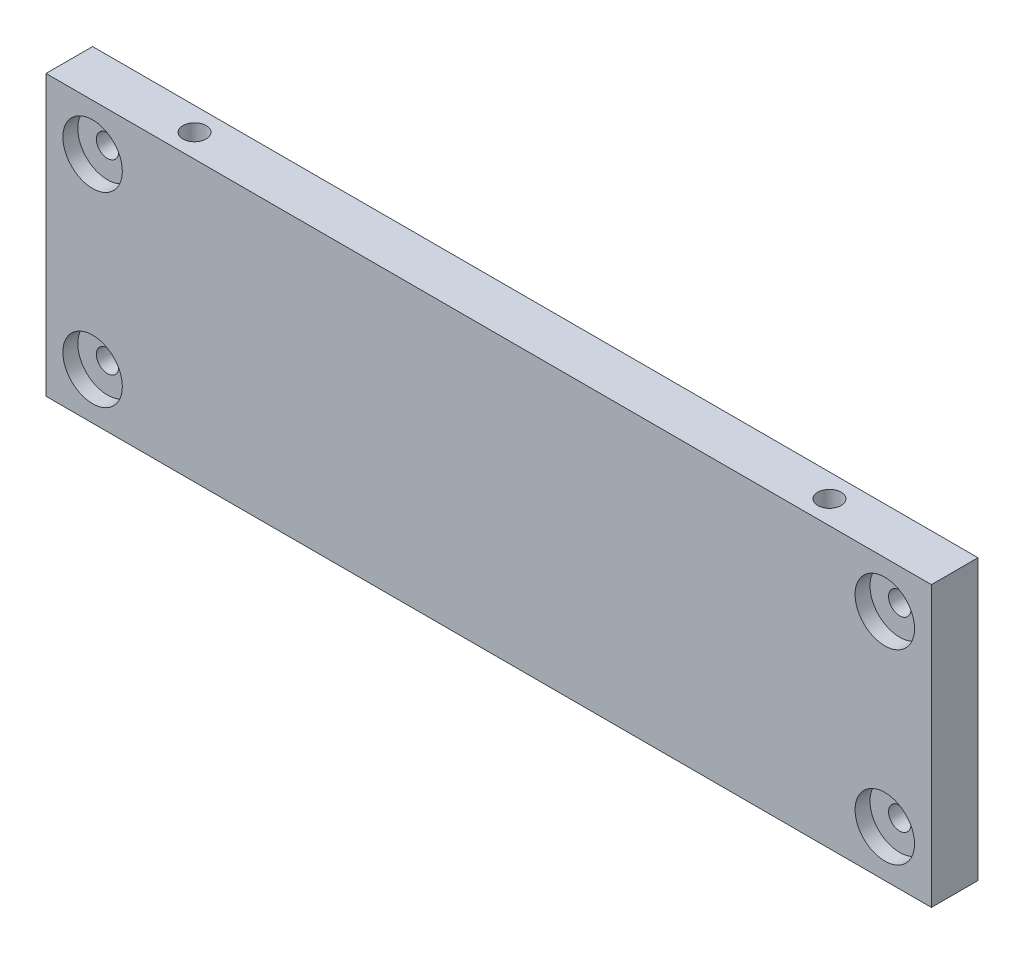
ISO-10303-21;
HEADER;
FILE_DESCRIPTION(('STEP AP214'),'2;1');
FILE_NAME('part.step','',(''),(''),'','','');
FILE_SCHEMA(('AUTOMOTIVE_DESIGN { 1 0 10303 214 1 1 1 1 }'));
ENDSEC;
DATA;
#1=APPLICATION_CONTEXT('core data for automotive mechanical design processes');
#2=APPLICATION_PROTOCOL_DEFINITION('international standard','automotive_design',2000,#1);
#3=PRODUCT_CONTEXT('',#1,'mechanical');
#4=PRODUCT('Part','Part','',(#3));
#5=PRODUCT_RELATED_PRODUCT_CATEGORY('part','',(#4));
#6=PRODUCT_DEFINITION_FORMATION('','',#4);
#7=PRODUCT_DEFINITION_CONTEXT('part definition',#1,'design');
#8=PRODUCT_DEFINITION('design','',#6,#7);
#9=PRODUCT_DEFINITION_SHAPE('','',#8);
#10=(LENGTH_UNIT() NAMED_UNIT(*) SI_UNIT(.MILLI.,.METRE.));
#11=(NAMED_UNIT(*) PLANE_ANGLE_UNIT() SI_UNIT($,.RADIAN.));
#12=(NAMED_UNIT(*) SI_UNIT($,.STERADIAN.) SOLID_ANGLE_UNIT());
#13=UNCERTAINTY_MEASURE_WITH_UNIT(LENGTH_MEASURE(1.E-05),#10,'distance_accuracy_value','');
#14=(GEOMETRIC_REPRESENTATION_CONTEXT(3) GLOBAL_UNCERTAINTY_ASSIGNED_CONTEXT((#13)) GLOBAL_UNIT_ASSIGNED_CONTEXT((#10,
#11,#12)) REPRESENTATION_CONTEXT('',''));
#15=CARTESIAN_POINT('',(0.,0.,0.));
#16=DIRECTION('',(0.,0.,1.));
#17=DIRECTION('',(1.,0.,0.));
#18=AXIS2_PLACEMENT_3D('',#15,#16,#17);
#19=CARTESIAN_POINT('',(-47.5,-15.,5.));
#20=DIRECTION('',(1.,0.,0.));
#21=DIRECTION('',(0.,0.,-1.));
#22=AXIS2_PLACEMENT_3D('',#19,#20,#21);
#23=PLANE('',#22);
#24=DIRECTION('',(0.,-1.,0.));
#25=VECTOR('',#24,1.);
#26=CARTESIAN_POINT('',(-47.5,-15.,0.));
#27=LINE('',#26,#25);
#28=CARTESIAN_POINT('',(-47.5,15.,0.));
#29=VERTEX_POINT('',#28);
#30=CARTESIAN_POINT('',(-47.5,-15.,0.));
#31=VERTEX_POINT('',#30);
#32=EDGE_CURVE('E197',#29,#31,#27,.T.);
#33=ORIENTED_EDGE('',*,*,#32,.T.);
#34=DIRECTION('',(0.,0.,-1.));
#35=VECTOR('',#34,1.);
#36=CARTESIAN_POINT('',(-47.5,-15.,5.));
#37=LINE('',#36,#35);
#38=CARTESIAN_POINT('',(-47.5,-15.,5.));
#39=VERTEX_POINT('',#38);
#40=EDGE_CURVE('E11',#39,#31,#37,.T.);
#41=ORIENTED_EDGE('',*,*,#40,.F.);
#42=DIRECTION('',(0.,-1.,0.));
#43=VECTOR('',#42,1.);
#44=CARTESIAN_POINT('',(-47.5,-15.,5.));
#45=LINE('',#44,#43);
#46=CARTESIAN_POINT('',(-47.5,15.,5.));
#47=VERTEX_POINT('',#46);
#48=EDGE_CURVE('E198',#47,#39,#45,.T.);
#49=ORIENTED_EDGE('',*,*,#48,.F.);
#50=DIRECTION('',(0.,0.,-1.));
#51=VECTOR('',#50,1.);
#52=CARTESIAN_POINT('',(-47.5,15.,5.));
#53=LINE('',#52,#51);
#54=EDGE_CURVE('E208',#47,#29,#53,.T.);
#55=ORIENTED_EDGE('',*,*,#54,.T.);
#56=EDGE_LOOP('',(#33,#41,#49,#55));
#57=FACE_BOUND('',#56,.T.);
#58=ADVANCED_FACE('F53',(#57),#23,.F.);
#59=CARTESIAN_POINT('',(47.5,-15.,5.));
#60=DIRECTION('',(0.,1.,0.));
#61=DIRECTION('',(0.,0.,1.));
#62=AXIS2_PLACEMENT_3D('',#59,#60,#61);
#63=PLANE('',#62);
#64=DIRECTION('',(1.,0.,0.));
#65=VECTOR('',#64,1.);
#66=CARTESIAN_POINT('',(47.5,-15.,0.));
#67=LINE('',#66,#65);
#68=CARTESIAN_POINT('',(47.5,-15.,0.));
#69=VERTEX_POINT('',#68);
#70=EDGE_CURVE('E212',#31,#69,#67,.T.);
#71=ORIENTED_EDGE('',*,*,#70,.T.);
#72=DIRECTION('',(0.,0.,-1.));
#73=VECTOR('',#72,1.);
#74=CARTESIAN_POINT('',(47.5,-15.,5.));
#75=LINE('',#74,#73);
#76=CARTESIAN_POINT('',(47.5,-15.,5.));
#77=VERTEX_POINT('',#76);
#78=EDGE_CURVE('E62',#77,#69,#75,.T.);
#79=ORIENTED_EDGE('',*,*,#78,.F.);
#80=DIRECTION('',(1.,0.,0.));
#81=VECTOR('',#80,1.);
#82=CARTESIAN_POINT('',(47.5,-15.,5.));
#83=LINE('',#82,#81);
#84=EDGE_CURVE('E101',#39,#77,#83,.T.);
#85=ORIENTED_EDGE('',*,*,#84,.F.);
#86=ORIENTED_EDGE('',*,*,#40,.T.);
#87=EDGE_LOOP('',(#71,#79,#85,#86));
#88=FACE_BOUND('',#87,.T.);
#89=ADVANCED_FACE('F244',(#88),#63,.F.);
#90=CARTESIAN_POINT('',(47.5,-15.,5.));
#91=DIRECTION('',(-1.,0.,0.));
#92=DIRECTION('',(0.,0.,1.));
#93=AXIS2_PLACEMENT_3D('',#90,#91,#92);
#94=PLANE('',#93);
#95=DIRECTION('',(0.,1.,0.));
#96=VECTOR('',#95,1.);
#97=CARTESIAN_POINT('',(47.5,-15.,0.));
#98=LINE('',#97,#96);
#99=CARTESIAN_POINT('',(47.5,15.,0.));
#100=VERTEX_POINT('',#99);
#101=EDGE_CURVE('E88',#69,#100,#98,.T.);
#102=ORIENTED_EDGE('',*,*,#101,.T.);
#103=DIRECTION('',(0.,0.,-1.));
#104=VECTOR('',#103,1.);
#105=CARTESIAN_POINT('',(47.5,15.,5.));
#106=LINE('',#105,#104);
#107=CARTESIAN_POINT('',(47.5,15.,5.));
#108=VERTEX_POINT('',#107);
#109=EDGE_CURVE('E221',#108,#100,#106,.T.);
#110=ORIENTED_EDGE('',*,*,#109,.F.);
#111=DIRECTION('',(0.,1.,0.));
#112=VECTOR('',#111,1.);
#113=CARTESIAN_POINT('',(47.5,-15.,5.));
#114=LINE('',#113,#112);
#115=EDGE_CURVE('E203',#77,#108,#114,.T.);
#116=ORIENTED_EDGE('',*,*,#115,.F.);
#117=ORIENTED_EDGE('',*,*,#78,.T.);
#118=EDGE_LOOP('',(#102,#110,#116,#117));
#119=FACE_BOUND('',#118,.T.);
#120=ADVANCED_FACE('F225',(#119),#94,.F.);
#121=CARTESIAN_POINT('',(47.5,15.,5.));
#122=DIRECTION('',(0.,-1.,0.));
#123=DIRECTION('',(0.,0.,-1.));
#124=AXIS2_PLACEMENT_3D('',#121,#122,#123);
#125=PLANE('',#124);
#126=CARTESIAN_POINT('',(-34.0619220870065,15.,2.5));
#127=DIRECTION('',(0.,1.,0.));
#128=DIRECTION('',(0.,0.,1.));
#129=AXIS2_PLACEMENT_3D('',#126,#127,#128);
#130=CIRCLE('',#129,1.25);
#131=CARTESIAN_POINT('',(-34.0619220870065,15.,3.75));
#132=VERTEX_POINT('',#131);
#133=EDGE_CURVE('E120',#132,#132,#130,.T.);
#134=ORIENTED_EDGE('',*,*,#133,.F.);
#135=EDGE_LOOP('',(#134));
#136=FACE_BOUND('',#135,.T.);
#137=CARTESIAN_POINT('',(34.0619220870065,15.,2.5));
#138=DIRECTION('',(0.,1.,0.));
#139=DIRECTION('',(0.,0.,1.));
#140=AXIS2_PLACEMENT_3D('',#137,#138,#139);
#141=CIRCLE('',#140,1.25);
#142=CARTESIAN_POINT('',(34.0619220870065,15.,3.75));
#143=VERTEX_POINT('',#142);
#144=EDGE_CURVE('E119',#143,#143,#141,.T.);
#145=ORIENTED_EDGE('',*,*,#144,.F.);
#146=EDGE_LOOP('',(#145));
#147=FACE_BOUND('',#146,.T.);
#148=DIRECTION('',(-1.,0.,0.));
#149=VECTOR('',#148,1.);
#150=CARTESIAN_POINT('',(47.5,15.,0.));
#151=LINE('',#150,#149);
#152=EDGE_CURVE('E94',#100,#29,#151,.T.);
#153=ORIENTED_EDGE('',*,*,#152,.T.);
#154=ORIENTED_EDGE('',*,*,#54,.F.);
#155=DIRECTION('',(-1.,0.,0.));
#156=VECTOR('',#155,1.);
#157=CARTESIAN_POINT('',(47.5,15.,5.));
#158=LINE('',#157,#156);
#159=EDGE_CURVE('E70',#108,#47,#158,.T.);
#160=ORIENTED_EDGE('',*,*,#159,.F.);
#161=ORIENTED_EDGE('',*,*,#109,.T.);
#162=EDGE_LOOP('',(#153,#154,#160,#161));
#163=FACE_BOUND('',#162,.T.);
#164=ADVANCED_FACE('F232',(#136,#147,#163),#125,.F.);
#165=CARTESIAN_POINT('',(0.,0.,5.));
#166=DIRECTION('',(0.,0.,1.));
#167=DIRECTION('',(1.,0.,0.));
#168=AXIS2_PLACEMENT_3D('',#165,#166,#167);
#169=PLANE('',#168);
#170=CARTESIAN_POINT('',(-42.5,10.,5.));
#171=DIRECTION('',(0.,0.,1.));
#172=DIRECTION('',(1.,0.,0.));
#173=AXIS2_PLACEMENT_3D('',#170,#171,#172);
#174=CIRCLE('',#173,3.19);
#175=CARTESIAN_POINT('',(-39.31,10.,5.));
#176=VERTEX_POINT('',#175);
#177=EDGE_CURVE('E133',#176,#176,#174,.T.);
#178=ORIENTED_EDGE('',*,*,#177,.F.);
#179=EDGE_LOOP('',(#178));
#180=FACE_BOUND('',#179,.T.);
#181=CARTESIAN_POINT('',(-42.5,-10.,5.));
#182=DIRECTION('',(0.,0.,1.));
#183=DIRECTION('',(1.,0.,0.));
#184=AXIS2_PLACEMENT_3D('',#181,#182,#183);
#185=CIRCLE('',#184,3.19);
#186=CARTESIAN_POINT('',(-39.31,-10.,5.));
#187=VERTEX_POINT('',#186);
#188=EDGE_CURVE('E149',#187,#187,#185,.T.);
#189=ORIENTED_EDGE('',*,*,#188,.F.);
#190=EDGE_LOOP('',(#189));
#191=FACE_BOUND('',#190,.T.);
#192=CARTESIAN_POINT('',(42.5,-10.,5.));
#193=DIRECTION('',(0.,0.,1.));
#194=DIRECTION('',(1.,0.,0.));
#195=AXIS2_PLACEMENT_3D('',#192,#193,#194);
#196=CIRCLE('',#195,3.19);
#197=CARTESIAN_POINT('',(45.69,-10.,5.));
#198=VERTEX_POINT('',#197);
#199=EDGE_CURVE('E165',#198,#198,#196,.T.);
#200=ORIENTED_EDGE('',*,*,#199,.F.);
#201=EDGE_LOOP('',(#200));
#202=FACE_BOUND('',#201,.T.);
#203=CARTESIAN_POINT('',(42.5,10.,5.));
#204=DIRECTION('',(0.,0.,1.));
#205=DIRECTION('',(1.,0.,0.));
#206=AXIS2_PLACEMENT_3D('',#203,#204,#205);
#207=CIRCLE('',#206,3.19);
#208=CARTESIAN_POINT('',(45.69,10.,5.));
#209=VERTEX_POINT('',#208);
#210=EDGE_CURVE('E181',#209,#209,#207,.T.);
#211=ORIENTED_EDGE('',*,*,#210,.F.);
#212=EDGE_LOOP('',(#211));
#213=FACE_BOUND('',#212,.T.);
#214=ORIENTED_EDGE('',*,*,#48,.T.);
#215=ORIENTED_EDGE('',*,*,#84,.T.);
#216=ORIENTED_EDGE('',*,*,#115,.T.);
#217=ORIENTED_EDGE('',*,*,#159,.T.);
#218=EDGE_LOOP('',(#214,#215,#216,#217));
#219=FACE_BOUND('',#218,.T.);
#220=ADVANCED_FACE('F234',(#180,#191,#202,#213,#219),#169,.T.);
#221=CARTESIAN_POINT('',(0.,0.,0.));
#222=DIRECTION('',(0.,0.,1.));
#223=DIRECTION('',(1.,0.,0.));
#224=AXIS2_PLACEMENT_3D('',#221,#222,#223);
#225=PLANE('',#224);
#226=CARTESIAN_POINT('',(-42.5,10.,0.));
#227=DIRECTION('',(0.,0.,1.));
#228=DIRECTION('',(1.,0.,0.));
#229=AXIS2_PLACEMENT_3D('',#226,#227,#228);
#230=CIRCLE('',#229,1.2);
#231=CARTESIAN_POINT('',(-41.3,10.,0.));
#232=VERTEX_POINT('',#231);
#233=EDGE_CURVE('E145',#232,#232,#230,.T.);
#234=ORIENTED_EDGE('',*,*,#233,.T.);
#235=EDGE_LOOP('',(#234));
#236=FACE_BOUND('',#235,.T.);
#237=CARTESIAN_POINT('',(-42.5,-10.,0.));
#238=DIRECTION('',(0.,0.,1.));
#239=DIRECTION('',(1.,0.,0.));
#240=AXIS2_PLACEMENT_3D('',#237,#238,#239);
#241=CIRCLE('',#240,1.2);
#242=CARTESIAN_POINT('',(-41.3,-10.,0.));
#243=VERTEX_POINT('',#242);
#244=EDGE_CURVE('E161',#243,#243,#241,.T.);
#245=ORIENTED_EDGE('',*,*,#244,.T.);
#246=EDGE_LOOP('',(#245));
#247=FACE_BOUND('',#246,.T.);
#248=CARTESIAN_POINT('',(42.5,-10.,0.));
#249=DIRECTION('',(0.,0.,1.));
#250=DIRECTION('',(1.,0.,0.));
#251=AXIS2_PLACEMENT_3D('',#248,#249,#250);
#252=CIRCLE('',#251,1.2);
#253=CARTESIAN_POINT('',(43.7,-10.,0.));
#254=VERTEX_POINT('',#253);
#255=EDGE_CURVE('E177',#254,#254,#252,.T.);
#256=ORIENTED_EDGE('',*,*,#255,.T.);
#257=EDGE_LOOP('',(#256));
#258=FACE_BOUND('',#257,.T.);
#259=CARTESIAN_POINT('',(42.5,10.,0.));
#260=DIRECTION('',(0.,0.,1.));
#261=DIRECTION('',(1.,0.,0.));
#262=AXIS2_PLACEMENT_3D('',#259,#260,#261);
#263=CIRCLE('',#262,1.2);
#264=CARTESIAN_POINT('',(43.7,10.,0.));
#265=VERTEX_POINT('',#264);
#266=EDGE_CURVE('E193',#265,#265,#263,.T.);
#267=ORIENTED_EDGE('',*,*,#266,.T.);
#268=EDGE_LOOP('',(#267));
#269=FACE_BOUND('',#268,.T.);
#270=ORIENTED_EDGE('',*,*,#32,.F.);
#271=ORIENTED_EDGE('',*,*,#152,.F.);
#272=ORIENTED_EDGE('',*,*,#101,.F.);
#273=ORIENTED_EDGE('',*,*,#70,.F.);
#274=EDGE_LOOP('',(#270,#271,#272,#273));
#275=FACE_BOUND('',#274,.T.);
#276=ADVANCED_FACE('F228',(#236,#247,#258,#269,#275),#225,.F.);
#277=CARTESIAN_POINT('',(42.5,10.,5.));
#278=DIRECTION('',(0.,0.,1.));
#279=DIRECTION('',(1.,0.,0.));
#280=AXIS2_PLACEMENT_3D('',#277,#278,#279);
#281=CYLINDRICAL_SURFACE('',#280,1.2);
#282=ORIENTED_EDGE('',*,*,#266,.F.);
#283=EDGE_LOOP('',(#282));
#284=FACE_BOUND('',#283,.T.);
#285=CARTESIAN_POINT('',(42.5,10.,3.4));
#286=DIRECTION('',(0.,0.,1.));
#287=DIRECTION('',(1.,0.,0.));
#288=AXIS2_PLACEMENT_3D('',#285,#286,#287);
#289=CIRCLE('',#288,1.2);
#290=CARTESIAN_POINT('',(43.7,10.,3.4));
#291=VERTEX_POINT('',#290);
#292=EDGE_CURVE('E189',#291,#291,#289,.T.);
#293=ORIENTED_EDGE('',*,*,#292,.T.);
#294=EDGE_LOOP('',(#293));
#295=FACE_BOUND('',#294,.T.);
#296=ADVANCED_FACE('F273',(#284,#295),#281,.F.);
#297=CARTESIAN_POINT('',(43.7,10.,3.4));
#298=DIRECTION('',(0.,0.,-1.));
#299=DIRECTION('',(-1.,0.,0.));
#300=AXIS2_PLACEMENT_3D('',#297,#298,#299);
#301=PLANE('',#300);
#302=ORIENTED_EDGE('',*,*,#292,.F.);
#303=EDGE_LOOP('',(#302));
#304=FACE_BOUND('',#303,.T.);
#305=CARTESIAN_POINT('',(42.5,10.,3.4));
#306=DIRECTION('',(0.,0.,1.));
#307=DIRECTION('',(1.,0.,0.));
#308=AXIS2_PLACEMENT_3D('',#305,#306,#307);
#309=CIRCLE('',#308,3.19);
#310=CARTESIAN_POINT('',(45.69,10.,3.4));
#311=VERTEX_POINT('',#310);
#312=EDGE_CURVE('E185',#311,#311,#309,.T.);
#313=ORIENTED_EDGE('',*,*,#312,.T.);
#314=EDGE_LOOP('',(#313));
#315=FACE_BOUND('',#314,.T.);
#316=ADVANCED_FACE('F281',(#304,#315),#301,.F.);
#317=CARTESIAN_POINT('',(42.5,10.,5.));
#318=DIRECTION('',(0.,0.,1.));
#319=DIRECTION('',(1.,0.,0.));
#320=AXIS2_PLACEMENT_3D('',#317,#318,#319);
#321=CYLINDRICAL_SURFACE('',#320,3.19);
#322=ORIENTED_EDGE('',*,*,#312,.F.);
#323=EDGE_LOOP('',(#322));
#324=FACE_BOUND('',#323,.T.);
#325=ORIENTED_EDGE('',*,*,#210,.T.);
#326=EDGE_LOOP('',(#325));
#327=FACE_BOUND('',#326,.T.);
#328=ADVANCED_FACE('F290',(#324,#327),#321,.F.);
#329=CARTESIAN_POINT('',(42.5,-10.,5.));
#330=DIRECTION('',(0.,0.,1.));
#331=DIRECTION('',(1.,0.,0.));
#332=AXIS2_PLACEMENT_3D('',#329,#330,#331);
#333=CYLINDRICAL_SURFACE('',#332,1.2);
#334=ORIENTED_EDGE('',*,*,#255,.F.);
#335=EDGE_LOOP('',(#334));
#336=FACE_BOUND('',#335,.T.);
#337=CARTESIAN_POINT('',(42.5,-10.,3.4));
#338=DIRECTION('',(0.,0.,1.));
#339=DIRECTION('',(1.,0.,0.));
#340=AXIS2_PLACEMENT_3D('',#337,#338,#339);
#341=CIRCLE('',#340,1.2);
#342=CARTESIAN_POINT('',(43.7,-10.,3.4));
#343=VERTEX_POINT('',#342);
#344=EDGE_CURVE('E173',#343,#343,#341,.T.);
#345=ORIENTED_EDGE('',*,*,#344,.T.);
#346=EDGE_LOOP('',(#345));
#347=FACE_BOUND('',#346,.T.);
#348=ADVANCED_FACE('F301',(#336,#347),#333,.F.);
#349=CARTESIAN_POINT('',(43.7,-10.,3.4));
#350=DIRECTION('',(0.,0.,-1.));
#351=DIRECTION('',(-1.,0.,0.));
#352=AXIS2_PLACEMENT_3D('',#349,#350,#351);
#353=PLANE('',#352);
#354=ORIENTED_EDGE('',*,*,#344,.F.);
#355=EDGE_LOOP('',(#354));
#356=FACE_BOUND('',#355,.T.);
#357=CARTESIAN_POINT('',(42.5,-10.,3.4));
#358=DIRECTION('',(0.,0.,1.));
#359=DIRECTION('',(1.,0.,0.));
#360=AXIS2_PLACEMENT_3D('',#357,#358,#359);
#361=CIRCLE('',#360,3.19);
#362=CARTESIAN_POINT('',(45.69,-10.,3.4));
#363=VERTEX_POINT('',#362);
#364=EDGE_CURVE('E169',#363,#363,#361,.T.);
#365=ORIENTED_EDGE('',*,*,#364,.T.);
#366=EDGE_LOOP('',(#365));
#367=FACE_BOUND('',#366,.T.);
#368=ADVANCED_FACE('F314',(#356,#367),#353,.F.);
#369=CARTESIAN_POINT('',(42.5,-10.,5.));
#370=DIRECTION('',(0.,0.,1.));
#371=DIRECTION('',(1.,0.,0.));
#372=AXIS2_PLACEMENT_3D('',#369,#370,#371);
#373=CYLINDRICAL_SURFACE('',#372,3.19);
#374=ORIENTED_EDGE('',*,*,#364,.F.);
#375=EDGE_LOOP('',(#374));
#376=FACE_BOUND('',#375,.T.);
#377=ORIENTED_EDGE('',*,*,#199,.T.);
#378=EDGE_LOOP('',(#377));
#379=FACE_BOUND('',#378,.T.);
#380=ADVANCED_FACE('F323',(#376,#379),#373,.F.);
#381=CARTESIAN_POINT('',(-42.5,-10.,5.));
#382=DIRECTION('',(0.,0.,1.));
#383=DIRECTION('',(1.,0.,0.));
#384=AXIS2_PLACEMENT_3D('',#381,#382,#383);
#385=CYLINDRICAL_SURFACE('',#384,1.2);
#386=ORIENTED_EDGE('',*,*,#244,.F.);
#387=EDGE_LOOP('',(#386));
#388=FACE_BOUND('',#387,.T.);
#389=CARTESIAN_POINT('',(-42.5,-10.,3.4));
#390=DIRECTION('',(0.,0.,1.));
#391=DIRECTION('',(1.,0.,0.));
#392=AXIS2_PLACEMENT_3D('',#389,#390,#391);
#393=CIRCLE('',#392,1.2);
#394=CARTESIAN_POINT('',(-41.3,-10.,3.4));
#395=VERTEX_POINT('',#394);
#396=EDGE_CURVE('E157',#395,#395,#393,.T.);
#397=ORIENTED_EDGE('',*,*,#396,.T.);
#398=EDGE_LOOP('',(#397));
#399=FACE_BOUND('',#398,.T.);
#400=ADVANCED_FACE('F333',(#388,#399),#385,.F.);
#401=CARTESIAN_POINT('',(-41.3,-10.,3.4));
#402=DIRECTION('',(0.,0.,-1.));
#403=DIRECTION('',(-1.,0.,0.));
#404=AXIS2_PLACEMENT_3D('',#401,#402,#403);
#405=PLANE('',#404);
#406=ORIENTED_EDGE('',*,*,#396,.F.);
#407=EDGE_LOOP('',(#406));
#408=FACE_BOUND('',#407,.T.);
#409=CARTESIAN_POINT('',(-42.5,-10.,3.4));
#410=DIRECTION('',(0.,0.,1.));
#411=DIRECTION('',(1.,0.,0.));
#412=AXIS2_PLACEMENT_3D('',#409,#410,#411);
#413=CIRCLE('',#412,3.19);
#414=CARTESIAN_POINT('',(-39.31,-10.,3.4));
#415=VERTEX_POINT('',#414);
#416=EDGE_CURVE('E153',#415,#415,#413,.T.);
#417=ORIENTED_EDGE('',*,*,#416,.T.);
#418=EDGE_LOOP('',(#417));
#419=FACE_BOUND('',#418,.T.);
#420=ADVANCED_FACE('F345',(#408,#419),#405,.F.);
#421=CARTESIAN_POINT('',(-42.5,-10.,5.));
#422=DIRECTION('',(0.,0.,1.));
#423=DIRECTION('',(1.,0.,0.));
#424=AXIS2_PLACEMENT_3D('',#421,#422,#423);
#425=CYLINDRICAL_SURFACE('',#424,3.19);
#426=ORIENTED_EDGE('',*,*,#416,.F.);
#427=EDGE_LOOP('',(#426));
#428=FACE_BOUND('',#427,.T.);
#429=ORIENTED_EDGE('',*,*,#188,.T.);
#430=EDGE_LOOP('',(#429));
#431=FACE_BOUND('',#430,.T.);
#432=ADVANCED_FACE('F354',(#428,#431),#425,.F.);
#433=CARTESIAN_POINT('',(-42.5,10.,5.));
#434=DIRECTION('',(0.,0.,1.));
#435=DIRECTION('',(1.,0.,0.));
#436=AXIS2_PLACEMENT_3D('',#433,#434,#435);
#437=CYLINDRICAL_SURFACE('',#436,1.2);
#438=ORIENTED_EDGE('',*,*,#233,.F.);
#439=EDGE_LOOP('',(#438));
#440=FACE_BOUND('',#439,.T.);
#441=CARTESIAN_POINT('',(-42.5,10.,3.4));
#442=DIRECTION('',(0.,0.,1.));
#443=DIRECTION('',(1.,0.,0.));
#444=AXIS2_PLACEMENT_3D('',#441,#442,#443);
#445=CIRCLE('',#444,1.2);
#446=CARTESIAN_POINT('',(-41.3,10.,3.4));
#447=VERTEX_POINT('',#446);
#448=EDGE_CURVE('E141',#447,#447,#445,.T.);
#449=ORIENTED_EDGE('',*,*,#448,.T.);
#450=EDGE_LOOP('',(#449));
#451=FACE_BOUND('',#450,.T.);
#452=ADVANCED_FACE('F364',(#440,#451),#437,.F.);
#453=CARTESIAN_POINT('',(-41.3,10.,3.4));
#454=DIRECTION('',(0.,0.,-1.));
#455=DIRECTION('',(-1.,0.,0.));
#456=AXIS2_PLACEMENT_3D('',#453,#454,#455);
#457=PLANE('',#456);
#458=ORIENTED_EDGE('',*,*,#448,.F.);
#459=EDGE_LOOP('',(#458));
#460=FACE_BOUND('',#459,.T.);
#461=CARTESIAN_POINT('',(-42.5,10.,3.4));
#462=DIRECTION('',(0.,0.,1.));
#463=DIRECTION('',(1.,0.,0.));
#464=AXIS2_PLACEMENT_3D('',#461,#462,#463);
#465=CIRCLE('',#464,3.19);
#466=CARTESIAN_POINT('',(-39.31,10.,3.4));
#467=VERTEX_POINT('',#466);
#468=EDGE_CURVE('E137',#467,#467,#465,.T.);
#469=ORIENTED_EDGE('',*,*,#468,.T.);
#470=EDGE_LOOP('',(#469));
#471=FACE_BOUND('',#470,.T.);
#472=ADVANCED_FACE('F376',(#460,#471),#457,.F.);
#473=CARTESIAN_POINT('',(-42.5,10.,5.));
#474=DIRECTION('',(0.,0.,1.));
#475=DIRECTION('',(1.,0.,0.));
#476=AXIS2_PLACEMENT_3D('',#473,#474,#475);
#477=CYLINDRICAL_SURFACE('',#476,3.19);
#478=ORIENTED_EDGE('',*,*,#468,.F.);
#479=EDGE_LOOP('',(#478));
#480=FACE_BOUND('',#479,.T.);
#481=ORIENTED_EDGE('',*,*,#177,.T.);
#482=EDGE_LOOP('',(#481));
#483=FACE_BOUND('',#482,.T.);
#484=ADVANCED_FACE('F385',(#480,#483),#477,.F.);
#485=CARTESIAN_POINT('',(34.0619220870065,12.,2.5));
#486=DIRECTION('',(0.,1.,0.));
#487=DIRECTION('',(0.,0.,1.));
#488=AXIS2_PLACEMENT_3D('',#485,#486,#487);
#489=CONICAL_SURFACE('',#488,1.25,1.02974425867665);
#490=CARTESIAN_POINT('',(34.0619220870065,11.2489242262155,2.5));
#491=VERTEX_POINT('',#490);
#492=VERTEX_LOOP('',#491);
#493=FACE_BOUND('',#492,.T.);
#494=CARTESIAN_POINT('',(34.0619220870065,12.,2.5));
#495=DIRECTION('',(0.,1.,0.));
#496=DIRECTION('',(0.,0.,1.));
#497=AXIS2_PLACEMENT_3D('',#494,#495,#496);
#498=CIRCLE('',#497,1.25);
#499=CARTESIAN_POINT('',(34.0619220870065,12.,3.75));
#500=VERTEX_POINT('',#499);
#501=EDGE_CURVE('E125',#500,#500,#498,.T.);
#502=ORIENTED_EDGE('',*,*,#501,.T.);
#503=EDGE_LOOP('',(#502));
#504=FACE_BOUND('',#503,.T.);
#505=ADVANCED_FACE('F395',(#493,#504),#489,.F.);
#506=CARTESIAN_POINT('',(34.0619220870065,15.,2.5));
#507=DIRECTION('',(0.,1.,0.));
#508=DIRECTION('',(0.,0.,1.));
#509=AXIS2_PLACEMENT_3D('',#506,#507,#508);
#510=CYLINDRICAL_SURFACE('',#509,1.25);
#511=ORIENTED_EDGE('',*,*,#501,.F.);
#512=EDGE_LOOP('',(#511));
#513=FACE_BOUND('',#512,.T.);
#514=ORIENTED_EDGE('',*,*,#144,.T.);
#515=EDGE_LOOP('',(#514));
#516=FACE_BOUND('',#515,.T.);
#517=ADVANCED_FACE('F112',(#513,#516),#510,.F.);
#518=CARTESIAN_POINT('',(-34.0619220870065,12.,2.5));
#519=DIRECTION('',(0.,1.,0.));
#520=DIRECTION('',(0.,0.,1.));
#521=AXIS2_PLACEMENT_3D('',#518,#519,#520);
#522=CONICAL_SURFACE('',#521,1.25,1.02974425867665);
#523=CARTESIAN_POINT('',(-34.0619220870065,11.2489242262155,2.5));
#524=VERTEX_POINT('',#523);
#525=VERTEX_LOOP('',#524);
#526=FACE_BOUND('',#525,.T.);
#527=CARTESIAN_POINT('',(-34.0619220870065,12.,2.5));
#528=DIRECTION('',(0.,1.,0.));
#529=DIRECTION('',(0.,0.,1.));
#530=AXIS2_PLACEMENT_3D('',#527,#528,#529);
#531=CIRCLE('',#530,1.25);
#532=CARTESIAN_POINT('',(-34.0619220870065,12.,3.75));
#533=VERTEX_POINT('',#532);
#534=EDGE_CURVE('E116',#533,#533,#531,.T.);
#535=ORIENTED_EDGE('',*,*,#534,.T.);
#536=EDGE_LOOP('',(#535));
#537=FACE_BOUND('',#536,.T.);
#538=ADVANCED_FACE('F108',(#526,#537),#522,.F.);
#539=CARTESIAN_POINT('',(-34.0619220870065,15.,2.5));
#540=DIRECTION('',(0.,1.,0.));
#541=DIRECTION('',(0.,0.,1.));
#542=AXIS2_PLACEMENT_3D('',#539,#540,#541);
#543=CYLINDRICAL_SURFACE('',#542,1.25);
#544=ORIENTED_EDGE('',*,*,#534,.F.);
#545=EDGE_LOOP('',(#544));
#546=FACE_BOUND('',#545,.T.);
#547=ORIENTED_EDGE('',*,*,#133,.T.);
#548=EDGE_LOOP('',(#547));
#549=FACE_BOUND('',#548,.T.);
#550=ADVANCED_FACE('F111',(#546,#549),#543,.F.);
#551=CLOSED_SHELL('',(#58,#89,#120,#164,#220,#276,#296,#316,#328,#348,#368,#380,#400,#420,#432,
#452,#472,#484,#505,#517,#538,#550));
#552=MANIFOLD_SOLID_BREP('B2',#551);
#553=ADVANCED_BREP_SHAPE_REPRESENTATION('',(#18,#552),#14);
#554=SHAPE_DEFINITION_REPRESENTATION(#9,#553);
ENDSEC;
END-ISO-10303-21;
